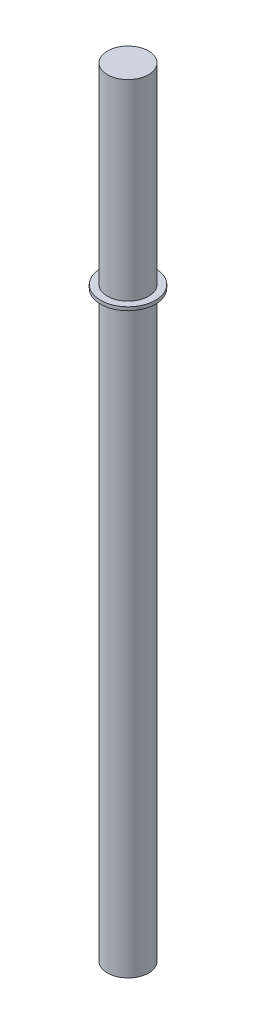
ISO-10303-21;
HEADER;
FILE_DESCRIPTION(('STEP AP214'),'2;1');
FILE_NAME('part.step','',(''),(''),'','','');
FILE_SCHEMA(('AUTOMOTIVE_DESIGN { 1 0 10303 214 1 1 1 1 }'));
ENDSEC;
DATA;
#1=APPLICATION_CONTEXT('core data for automotive mechanical design processes');
#2=APPLICATION_PROTOCOL_DEFINITION('international standard','automotive_design',2000,#1);
#3=PRODUCT_CONTEXT('',#1,'mechanical');
#4=PRODUCT('Part','Part','',(#3));
#5=PRODUCT_RELATED_PRODUCT_CATEGORY('part','',(#4));
#6=PRODUCT_DEFINITION_FORMATION('','',#4);
#7=PRODUCT_DEFINITION_CONTEXT('part definition',#1,'design');
#8=PRODUCT_DEFINITION('design','',#6,#7);
#9=PRODUCT_DEFINITION_SHAPE('','',#8);
#10=(LENGTH_UNIT() NAMED_UNIT(*) SI_UNIT(.MILLI.,.METRE.));
#11=(NAMED_UNIT(*) PLANE_ANGLE_UNIT() SI_UNIT($,.RADIAN.));
#12=(NAMED_UNIT(*) SI_UNIT($,.STERADIAN.) SOLID_ANGLE_UNIT());
#13=UNCERTAINTY_MEASURE_WITH_UNIT(LENGTH_MEASURE(1.E-05),#10,'distance_accuracy_value','');
#14=(GEOMETRIC_REPRESENTATION_CONTEXT(3) GLOBAL_UNCERTAINTY_ASSIGNED_CONTEXT((#13)) GLOBAL_UNIT_ASSIGNED_CONTEXT((#10,
#11,#12)) REPRESENTATION_CONTEXT('',''));
#15=CARTESIAN_POINT('',(0.,0.,0.));
#16=DIRECTION('',(0.,0.,1.));
#17=DIRECTION('',(1.,0.,0.));
#18=AXIS2_PLACEMENT_3D('',#15,#16,#17);
#19=CARTESIAN_POINT('',(0.,28.,0.));
#20=DIRECTION('',(0.,-1.,0.));
#21=DIRECTION('',(0.,0.,-1.));
#22=AXIS2_PLACEMENT_3D('',#19,#20,#21);
#23=CYLINDRICAL_SURFACE('',#22,3.);
#24=CARTESIAN_POINT('',(0.,28.,0.));
#25=DIRECTION('',(0.,1.,0.));
#26=DIRECTION('',(0.,0.,1.));
#27=AXIS2_PLACEMENT_3D('',#24,#25,#26);
#28=CIRCLE('',#27,3.);
#29=CARTESIAN_POINT('',(0.,28.,3.));
#30=VERTEX_POINT('',#29);
#31=EDGE_CURVE('E45',#30,#30,#28,.T.);
#32=ORIENTED_EDGE('',*,*,#31,.F.);
#33=EDGE_LOOP('',(#32));
#34=FACE_BOUND('',#33,.T.);
#35=CARTESIAN_POINT('',(0.,0.,0.));
#36=DIRECTION('',(0.,1.,0.));
#37=DIRECTION('',(0.,0.,1.));
#38=AXIS2_PLACEMENT_3D('',#35,#36,#37);
#39=CIRCLE('',#38,3.);
#40=CARTESIAN_POINT('',(0.,0.,3.));
#41=VERTEX_POINT('',#40);
#42=EDGE_CURVE('E40',#41,#41,#39,.T.);
#43=ORIENTED_EDGE('',*,*,#42,.T.);
#44=EDGE_LOOP('',(#43));
#45=FACE_BOUND('',#44,.T.);
#46=ADVANCED_FACE('F37',(#34,#45),#23,.T.);
#47=CARTESIAN_POINT('',(0.,28.,0.));
#48=DIRECTION('',(0.,1.,0.));
#49=DIRECTION('',(0.,0.,1.));
#50=AXIS2_PLACEMENT_3D('',#47,#48,#49);
#51=PLANE('',#50);
#52=ORIENTED_EDGE('',*,*,#31,.T.);
#53=EDGE_LOOP('',(#52));
#54=FACE_BOUND('',#53,.T.);
#55=ADVANCED_FACE('F83',(#54),#51,.T.);
#56=CARTESIAN_POINT('',(0.,-0.5,0.));
#57=DIRECTION('',(0.,1.,0.));
#58=DIRECTION('',(0.,0.,1.));
#59=AXIS2_PLACEMENT_3D('',#56,#57,#58);
#60=CYLINDRICAL_SURFACE('',#59,4.);
#61=CARTESIAN_POINT('',(0.,-0.5,0.));
#62=DIRECTION('',(0.,-1.,0.));
#63=DIRECTION('',(0.,0.,-1.));
#64=AXIS2_PLACEMENT_3D('',#61,#62,#63);
#65=CIRCLE('',#64,4.);
#66=CARTESIAN_POINT('',(0.,-0.5,-4.));
#67=VERTEX_POINT('',#66);
#68=EDGE_CURVE('E54',#67,#67,#65,.T.);
#69=ORIENTED_EDGE('',*,*,#68,.F.);
#70=EDGE_LOOP('',(#69));
#71=FACE_BOUND('',#70,.T.);
#72=CARTESIAN_POINT('',(0.,0.,0.));
#73=DIRECTION('',(0.,-1.,0.));
#74=DIRECTION('',(0.,0.,-1.));
#75=AXIS2_PLACEMENT_3D('',#72,#73,#74);
#76=CIRCLE('',#75,4.);
#77=CARTESIAN_POINT('',(0.,0.,-4.));
#78=VERTEX_POINT('',#77);
#79=EDGE_CURVE('E58',#78,#78,#76,.T.);
#80=ORIENTED_EDGE('',*,*,#79,.T.);
#81=EDGE_LOOP('',(#80));
#82=FACE_BOUND('',#81,.T.);
#83=ADVANCED_FACE('F88',(#71,#82),#60,.T.);
#84=CARTESIAN_POINT('',(0.,-0.5,0.));
#85=DIRECTION('',(0.,-1.,0.));
#86=DIRECTION('',(0.,0.,-1.));
#87=AXIS2_PLACEMENT_3D('',#84,#85,#86);
#88=PLANE('',#87);
#89=CARTESIAN_POINT('',(0.,-0.5,0.));
#90=DIRECTION('',(0.,-1.,0.));
#91=DIRECTION('',(0.,0.,-1.));
#92=AXIS2_PLACEMENT_3D('',#89,#90,#91);
#93=CIRCLE('',#92,3.);
#94=CARTESIAN_POINT('',(0.,-0.5,-3.));
#95=VERTEX_POINT('',#94);
#96=EDGE_CURVE('E10',#95,#95,#93,.T.);
#97=ORIENTED_EDGE('',*,*,#96,.F.);
#98=EDGE_LOOP('',(#97));
#99=FACE_BOUND('',#98,.T.);
#100=ORIENTED_EDGE('',*,*,#68,.T.);
#101=EDGE_LOOP('',(#100));
#102=FACE_BOUND('',#101,.T.);
#103=ADVANCED_FACE('F78',(#99,#102),#88,.T.);
#104=CARTESIAN_POINT('',(0.,0.,0.));
#105=DIRECTION('',(0.,-1.,0.));
#106=DIRECTION('',(0.,0.,-1.));
#107=AXIS2_PLACEMENT_3D('',#104,#105,#106);
#108=PLANE('',#107);
#109=ORIENTED_EDGE('',*,*,#42,.F.);
#110=EDGE_LOOP('',(#109));
#111=FACE_BOUND('',#110,.T.);
#112=ORIENTED_EDGE('',*,*,#79,.F.);
#113=EDGE_LOOP('',(#112));
#114=FACE_BOUND('',#113,.T.);
#115=ADVANCED_FACE('F71',(#111,#114),#108,.F.);
#116=CARTESIAN_POINT('',(0.,-85.5,0.));
#117=DIRECTION('',(0.,1.,0.));
#118=DIRECTION('',(0.,0.,1.));
#119=AXIS2_PLACEMENT_3D('',#116,#117,#118);
#120=CYLINDRICAL_SURFACE('',#119,3.);
#121=CARTESIAN_POINT('',(0.,-85.5,0.));
#122=DIRECTION('',(0.,-1.,0.));
#123=DIRECTION('',(0.,0.,-1.));
#124=AXIS2_PLACEMENT_3D('',#121,#122,#123);
#125=CIRCLE('',#124,3.);
#126=CARTESIAN_POINT('',(0.,-85.5,-3.));
#127=VERTEX_POINT('',#126);
#128=EDGE_CURVE('E53',#127,#127,#125,.T.);
#129=ORIENTED_EDGE('',*,*,#128,.F.);
#130=EDGE_LOOP('',(#129));
#131=FACE_BOUND('',#130,.T.);
#132=ORIENTED_EDGE('',*,*,#96,.T.);
#133=EDGE_LOOP('',(#132));
#134=FACE_BOUND('',#133,.T.);
#135=ADVANCED_FACE('F69',(#131,#134),#120,.T.);
#136=CARTESIAN_POINT('',(0.,-85.5,0.));
#137=DIRECTION('',(0.,-1.,0.));
#138=DIRECTION('',(0.,0.,-1.));
#139=AXIS2_PLACEMENT_3D('',#136,#137,#138);
#140=PLANE('',#139);
#141=ORIENTED_EDGE('',*,*,#128,.T.);
#142=EDGE_LOOP('',(#141));
#143=FACE_BOUND('',#142,.T.);
#144=ADVANCED_FACE('F67',(#143),#140,.T.);
#145=CLOSED_SHELL('',(#46,#55,#83,#103,#115,#135,#144));
#146=MANIFOLD_SOLID_BREP('B2',#145);
#147=ADVANCED_BREP_SHAPE_REPRESENTATION('',(#18,#146),#14);
#148=SHAPE_DEFINITION_REPRESENTATION(#9,#147);
ENDSEC;
END-ISO-10303-21;
